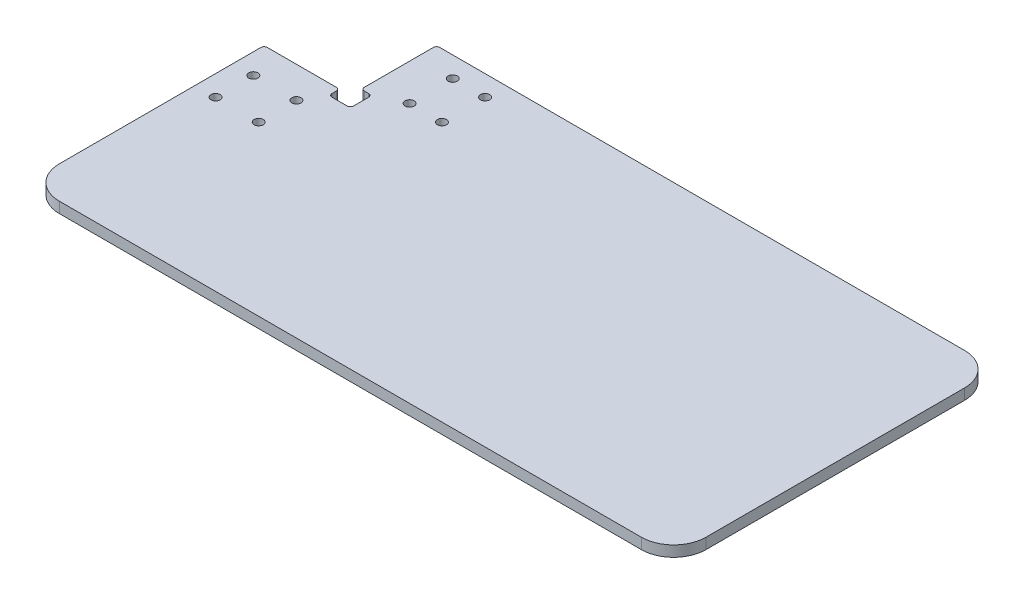
ISO-10303-21;
HEADER;
FILE_DESCRIPTION(('STEP AP214'),'2;1');
FILE_NAME('part.step','',(''),(''),'','','');
FILE_SCHEMA(('AUTOMOTIVE_DESIGN { 1 0 10303 214 1 1 1 1 }'));
ENDSEC;
DATA;
#1=APPLICATION_CONTEXT('core data for automotive mechanical design processes');
#2=APPLICATION_PROTOCOL_DEFINITION('international standard','automotive_design',2000,#1);
#3=PRODUCT_CONTEXT('',#1,'mechanical');
#4=PRODUCT('Part','Part','',(#3));
#5=PRODUCT_RELATED_PRODUCT_CATEGORY('part','',(#4));
#6=PRODUCT_DEFINITION_FORMATION('','',#4);
#7=PRODUCT_DEFINITION_CONTEXT('part definition',#1,'design');
#8=PRODUCT_DEFINITION('design','',#6,#7);
#9=PRODUCT_DEFINITION_SHAPE('','',#8);
#10=(LENGTH_UNIT() NAMED_UNIT(*) SI_UNIT(.MILLI.,.METRE.));
#11=(NAMED_UNIT(*) PLANE_ANGLE_UNIT() SI_UNIT($,.RADIAN.));
#12=(NAMED_UNIT(*) SI_UNIT($,.STERADIAN.) SOLID_ANGLE_UNIT());
#13=UNCERTAINTY_MEASURE_WITH_UNIT(LENGTH_MEASURE(1.E-05),#10,'distance_accuracy_value','');
#14=(GEOMETRIC_REPRESENTATION_CONTEXT(3) GLOBAL_UNCERTAINTY_ASSIGNED_CONTEXT((#13)) GLOBAL_UNIT_ASSIGNED_CONTEXT((#10,
#11,#12)) REPRESENTATION_CONTEXT('',''));
#15=CARTESIAN_POINT('',(0.,0.,0.));
#16=DIRECTION('',(0.,0.,1.));
#17=DIRECTION('',(1.,0.,0.));
#18=AXIS2_PLACEMENT_3D('',#15,#16,#17);
#19=CARTESIAN_POINT('',(0.,10.,0.));
#20=DIRECTION('',(0.,1.,0.));
#21=DIRECTION('',(0.,0.,1.));
#22=AXIS2_PLACEMENT_3D('',#19,#20,#21);
#23=PLANE('',#22);
#24=CARTESIAN_POINT('',(19.,10.,144.));
#25=DIRECTION('',(0.,1.,0.));
#26=DIRECTION('',(0.,0.,1.));
#27=AXIS2_PLACEMENT_3D('',#24,#25,#26);
#28=CIRCLE('',#27,4.25);
#29=CARTESIAN_POINT('',(19.,10.,148.25));
#30=VERTEX_POINT('',#29);
#31=EDGE_CURVE('E479',#30,#30,#28,.T.);
#32=ORIENTED_EDGE('',*,*,#31,.F.);
#33=EDGE_LOOP('',(#32));
#34=FACE_BOUND('',#33,.T.);
#35=CARTESIAN_POINT('',(19.,10.,109.));
#36=DIRECTION('',(0.,1.,0.));
#37=DIRECTION('',(0.,0.,1.));
#38=AXIS2_PLACEMENT_3D('',#35,#36,#37);
#39=CIRCLE('',#38,4.25);
#40=CARTESIAN_POINT('',(19.,10.,113.25));
#41=VERTEX_POINT('',#40);
#42=EDGE_CURVE('E467',#41,#41,#39,.T.);
#43=ORIENTED_EDGE('',*,*,#42,.F.);
#44=EDGE_LOOP('',(#43));
#45=FACE_BOUND('',#44,.T.);
#46=CARTESIAN_POINT('',(144.,10.,59.));
#47=DIRECTION('',(0.,1.,0.));
#48=DIRECTION('',(0.,0.,1.));
#49=AXIS2_PLACEMENT_3D('',#46,#47,#48);
#50=CIRCLE('',#49,4.25000000000001);
#51=CARTESIAN_POINT('',(144.,10.,63.25));
#52=VERTEX_POINT('',#51);
#53=EDGE_CURVE('E455',#52,#52,#50,.T.);
#54=ORIENTED_EDGE('',*,*,#53,.F.);
#55=EDGE_LOOP('',(#54));
#56=FACE_BOUND('',#55,.T.);
#57=CARTESIAN_POINT('',(144.,10.,19.));
#58=DIRECTION('',(0.,1.,0.));
#59=DIRECTION('',(0.,0.,1.));
#60=AXIS2_PLACEMENT_3D('',#57,#58,#59);
#61=CIRCLE('',#60,4.25);
#62=CARTESIAN_POINT('',(144.,10.,23.25));
#63=VERTEX_POINT('',#62);
#64=EDGE_CURVE('E208',#63,#63,#61,.T.);
#65=ORIENTED_EDGE('',*,*,#64,.F.);
#66=EDGE_LOOP('',(#65));
#67=FACE_BOUND('',#66,.T.);
#68=DIRECTION('',(0.,0.,-1.));
#69=VECTOR('',#68,1.);
#70=CARTESIAN_POINT('',(70.,10.,90.));
#71=LINE('',#70,#69);
#72=CARTESIAN_POINT('',(70.,10.,87.));
#73=VERTEX_POINT('',#72);
#74=CARTESIAN_POINT('',(70.,10.,83.));
#75=VERTEX_POINT('',#74);
#76=EDGE_CURVE('E322',#73,#75,#71,.T.);
#77=ORIENTED_EDGE('',*,*,#76,.T.);
#78=CARTESIAN_POINT('',(67.,10.,83.));
#79=DIRECTION('',(0.,1.,0.));
#80=DIRECTION('',(0.,0.,1.));
#81=AXIS2_PLACEMENT_3D('',#78,#79,#80);
#82=CIRCLE('',#81,3.);
#83=CARTESIAN_POINT('',(67.,10.,80.));
#84=VERTEX_POINT('',#83);
#85=EDGE_CURVE('E289',#75,#84,#82,.T.);
#86=ORIENTED_EDGE('',*,*,#85,.T.);
#87=DIRECTION('',(-1.,0.,0.));
#88=VECTOR('',#87,1.);
#89=CARTESIAN_POINT('',(70.,10.,80.));
#90=LINE('',#89,#88);
#91=CARTESIAN_POINT('',(3.00000000000003,10.,80.));
#92=VERTEX_POINT('',#91);
#93=EDGE_CURVE('E328',#84,#92,#90,.T.);
#94=ORIENTED_EDGE('',*,*,#93,.T.);
#95=CARTESIAN_POINT('',(3.00000000000004,10.,83.));
#96=DIRECTION('',(0.,1.,0.));
#97=DIRECTION('',(0.,0.,1.));
#98=AXIS2_PLACEMENT_3D('',#95,#96,#97);
#99=CIRCLE('',#98,3.);
#100=CARTESIAN_POINT('',(0.,10.,83.));
#101=VERTEX_POINT('',#100);
#102=EDGE_CURVE('E50',#92,#101,#99,.T.);
#103=ORIENTED_EDGE('',*,*,#102,.T.);
#104=DIRECTION('',(0.,0.,1.));
#105=VECTOR('',#104,1.);
#106=CARTESIAN_POINT('',(0.,10.,80.));
#107=LINE('',#106,#105);
#108=CARTESIAN_POINT('',(0.,10.,270.));
#109=VERTEX_POINT('',#108);
#110=EDGE_CURVE('E330',#101,#109,#107,.T.);
#111=ORIENTED_EDGE('',*,*,#110,.T.);
#112=CARTESIAN_POINT('',(30.0000000000001,10.,270.));
#113=DIRECTION('',(0.,1.,0.));
#114=DIRECTION('',(0.,0.,1.));
#115=AXIS2_PLACEMENT_3D('',#112,#113,#114);
#116=CIRCLE('',#115,30.);
#117=CARTESIAN_POINT('',(30.0000000000001,10.,300.));
#118=VERTEX_POINT('',#117);
#119=EDGE_CURVE('E240',#109,#118,#116,.T.);
#120=ORIENTED_EDGE('',*,*,#119,.T.);
#121=DIRECTION('',(1.,0.,0.));
#122=VECTOR('',#121,1.);
#123=CARTESIAN_POINT('',(1.02132162786543E-13,10.,300.));
#124=LINE('',#123,#122);
#125=CARTESIAN_POINT('',(570.,10.,300.));
#126=VERTEX_POINT('',#125);
#127=EDGE_CURVE('E196',#118,#126,#124,.T.);
#128=ORIENTED_EDGE('',*,*,#127,.T.);
#129=CARTESIAN_POINT('',(570.,10.,270.));
#130=DIRECTION('',(0.,1.,0.));
#131=DIRECTION('',(0.,0.,1.));
#132=AXIS2_PLACEMENT_3D('',#129,#130,#131);
#133=CIRCLE('',#132,30.);
#134=CARTESIAN_POINT('',(600.,10.,270.));
#135=VERTEX_POINT('',#134);
#136=EDGE_CURVE('E238',#126,#135,#133,.T.);
#137=ORIENTED_EDGE('',*,*,#136,.T.);
#138=DIRECTION('',(0.,0.,-1.));
#139=VECTOR('',#138,1.);
#140=CARTESIAN_POINT('',(600.,10.,0.));
#141=LINE('',#140,#139);
#142=CARTESIAN_POINT('',(600.,10.,30.));
#143=VERTEX_POINT('',#142);
#144=EDGE_CURVE('E230',#135,#143,#141,.T.);
#145=ORIENTED_EDGE('',*,*,#144,.T.);
#146=CARTESIAN_POINT('',(570.,10.,30.));
#147=DIRECTION('',(0.,1.,0.));
#148=DIRECTION('',(0.,0.,1.));
#149=AXIS2_PLACEMENT_3D('',#146,#147,#148);
#150=CIRCLE('',#149,30.);
#151=CARTESIAN_POINT('',(570.,10.,0.));
#152=VERTEX_POINT('',#151);
#153=EDGE_CURVE('E242',#143,#152,#150,.T.);
#154=ORIENTED_EDGE('',*,*,#153,.T.);
#155=DIRECTION('',(-1.,0.,0.));
#156=VECTOR('',#155,1.);
#157=CARTESIAN_POINT('',(80.,10.,0.));
#158=LINE('',#157,#156);
#159=CARTESIAN_POINT('',(83.,10.,0.));
#160=VERTEX_POINT('',#159);
#161=EDGE_CURVE('E194',#152,#160,#158,.T.);
#162=ORIENTED_EDGE('',*,*,#161,.T.);
#163=CARTESIAN_POINT('',(83.,10.,3.));
#164=DIRECTION('',(0.,1.,0.));
#165=DIRECTION('',(0.,0.,1.));
#166=AXIS2_PLACEMENT_3D('',#163,#164,#165);
#167=CIRCLE('',#166,3.);
#168=CARTESIAN_POINT('',(80.,10.,3.));
#169=VERTEX_POINT('',#168);
#170=EDGE_CURVE('E285',#160,#169,#167,.T.);
#171=ORIENTED_EDGE('',*,*,#170,.T.);
#172=DIRECTION('',(0.,0.,1.));
#173=VECTOR('',#172,1.);
#174=CARTESIAN_POINT('',(80.,10.,0.));
#175=LINE('',#174,#173);
#176=CARTESIAN_POINT('',(80.,10.,67.));
#177=VERTEX_POINT('',#176);
#178=EDGE_CURVE('E440',#169,#177,#175,.T.);
#179=ORIENTED_EDGE('',*,*,#178,.T.);
#180=CARTESIAN_POINT('',(83.,10.,67.));
#181=DIRECTION('',(0.,1.,0.));
#182=DIRECTION('',(0.,0.,1.));
#183=AXIS2_PLACEMENT_3D('',#180,#181,#182);
#184=CIRCLE('',#183,3.);
#185=CARTESIAN_POINT('',(83.,10.,70.));
#186=VERTEX_POINT('',#185);
#187=EDGE_CURVE('E287',#177,#186,#184,.T.);
#188=ORIENTED_EDGE('',*,*,#187,.T.);
#189=DIRECTION('',(1.,0.,0.));
#190=VECTOR('',#189,1.);
#191=CARTESIAN_POINT('',(80.,10.,70.));
#192=LINE('',#191,#190);
#193=CARTESIAN_POINT('',(87.,10.,70.));
#194=VERTEX_POINT('',#193);
#195=EDGE_CURVE('E439',#186,#194,#192,.T.);
#196=ORIENTED_EDGE('',*,*,#195,.T.);
#197=CARTESIAN_POINT('',(87.,10.,73.));
#198=DIRECTION('',(0.,1.,0.));
#199=DIRECTION('',(0.,0.,1.));
#200=AXIS2_PLACEMENT_3D('',#197,#198,#199);
#201=CIRCLE('',#200,3.);
#202=CARTESIAN_POINT('',(90.,10.,73.));
#203=VERTEX_POINT('',#202);
#204=EDGE_CURVE('E302',#194,#203,#201,.F.);
#205=ORIENTED_EDGE('',*,*,#204,.T.);
#206=DIRECTION('',(0.,0.,1.));
#207=VECTOR('',#206,1.);
#208=CARTESIAN_POINT('',(90.,10.,70.));
#209=LINE('',#208,#207);
#210=CARTESIAN_POINT('',(90.,10.,87.));
#211=VERTEX_POINT('',#210);
#212=EDGE_CURVE('E332',#203,#211,#209,.T.);
#213=ORIENTED_EDGE('',*,*,#212,.T.);
#214=CARTESIAN_POINT('',(87.,10.,87.));
#215=DIRECTION('',(0.,1.,0.));
#216=DIRECTION('',(0.,0.,1.));
#217=AXIS2_PLACEMENT_3D('',#214,#215,#216);
#218=CIRCLE('',#217,3.);
#219=CARTESIAN_POINT('',(87.,10.,90.));
#220=VERTEX_POINT('',#219);
#221=EDGE_CURVE('E306',#211,#220,#218,.F.);
#222=ORIENTED_EDGE('',*,*,#221,.T.);
#223=DIRECTION('',(-1.,0.,0.));
#224=VECTOR('',#223,1.);
#225=CARTESIAN_POINT('',(90.,10.,90.));
#226=LINE('',#225,#224);
#227=CARTESIAN_POINT('',(73.,10.,90.));
#228=VERTEX_POINT('',#227);
#229=EDGE_CURVE('E324',#220,#228,#226,.T.);
#230=ORIENTED_EDGE('',*,*,#229,.T.);
#231=CARTESIAN_POINT('',(73.,10.,87.));
#232=DIRECTION('',(0.,1.,0.));
#233=DIRECTION('',(0.,0.,1.));
#234=AXIS2_PLACEMENT_3D('',#231,#232,#233);
#235=CIRCLE('',#234,3.);
#236=EDGE_CURVE('E11',#228,#73,#235,.F.);
#237=ORIENTED_EDGE('',*,*,#236,.T.);
#238=EDGE_LOOP('',(#77,#86,#94,#103,#111,#120,#128,#137,#145,#154,#162,#171,#179,#188,#196,#205,
#213,#222,#230,#237));
#239=FACE_BOUND('',#238,.T.);
#240=CARTESIAN_POINT('',(114.,10.,19.));
#241=DIRECTION('',(0.,1.,0.));
#242=DIRECTION('',(0.,0.,1.));
#243=AXIS2_PLACEMENT_3D('',#240,#241,#242);
#244=CIRCLE('',#243,4.25);
#245=CARTESIAN_POINT('',(114.,10.,23.25));
#246=VERTEX_POINT('',#245);
#247=EDGE_CURVE('E449',#246,#246,#244,.T.);
#248=ORIENTED_EDGE('',*,*,#247,.F.);
#249=EDGE_LOOP('',(#248));
#250=FACE_BOUND('',#249,.T.);
#251=CARTESIAN_POINT('',(114.,10.,59.));
#252=DIRECTION('',(0.,1.,0.));
#253=DIRECTION('',(0.,0.,1.));
#254=AXIS2_PLACEMENT_3D('',#251,#252,#253);
#255=CIRCLE('',#254,4.25000000000001);
#256=CARTESIAN_POINT('',(114.,10.,63.25));
#257=VERTEX_POINT('',#256);
#258=EDGE_CURVE('E461',#257,#257,#255,.T.);
#259=ORIENTED_EDGE('',*,*,#258,.F.);
#260=EDGE_LOOP('',(#259));
#261=FACE_BOUND('',#260,.T.);
#262=CARTESIAN_POINT('',(59.,10.,109.));
#263=DIRECTION('',(0.,1.,0.));
#264=DIRECTION('',(0.,0.,1.));
#265=AXIS2_PLACEMENT_3D('',#262,#263,#264);
#266=CIRCLE('',#265,4.25000000000003);
#267=CARTESIAN_POINT('',(59.,10.,113.25));
#268=VERTEX_POINT('',#267);
#269=EDGE_CURVE('E473',#268,#268,#266,.T.);
#270=ORIENTED_EDGE('',*,*,#269,.F.);
#271=EDGE_LOOP('',(#270));
#272=FACE_BOUND('',#271,.T.);
#273=CARTESIAN_POINT('',(59.,10.,144.));
#274=DIRECTION('',(0.,1.,0.));
#275=DIRECTION('',(0.,0.,1.));
#276=AXIS2_PLACEMENT_3D('',#273,#274,#275);
#277=CIRCLE('',#276,4.25000000000002);
#278=CARTESIAN_POINT('',(59.,10.,148.25));
#279=VERTEX_POINT('',#278);
#280=EDGE_CURVE('E485',#279,#279,#277,.T.);
#281=ORIENTED_EDGE('',*,*,#280,.F.);
#282=EDGE_LOOP('',(#281));
#283=FACE_BOUND('',#282,.T.);
#284=ADVANCED_FACE('F35',(#34,#45,#56,#67,#239,#250,#261,#272,#283),#23,.T.);
#285=CARTESIAN_POINT('',(0.,0.,0.));
#286=DIRECTION('',(0.,1.,0.));
#287=DIRECTION('',(0.,0.,1.));
#288=AXIS2_PLACEMENT_3D('',#285,#286,#287);
#289=PLANE('',#288);
#290=DIRECTION('',(-1.,0.,0.));
#291=VECTOR('',#290,1.);
#292=CARTESIAN_POINT('',(70.,0.,80.));
#293=LINE('',#292,#291);
#294=CARTESIAN_POINT('',(67.,0.,80.));
#295=VERTEX_POINT('',#294);
#296=CARTESIAN_POINT('',(3.00000000000003,0.,80.));
#297=VERTEX_POINT('',#296);
#298=EDGE_CURVE('E223',#295,#297,#293,.T.);
#299=ORIENTED_EDGE('',*,*,#298,.F.);
#300=CARTESIAN_POINT('',(67.,0.,83.));
#301=DIRECTION('',(0.,1.,0.));
#302=DIRECTION('',(0.,0.,1.));
#303=AXIS2_PLACEMENT_3D('',#300,#301,#302);
#304=CIRCLE('',#303,3.);
#305=CARTESIAN_POINT('',(70.,0.,83.));
#306=VERTEX_POINT('',#305);
#307=EDGE_CURVE('E282',#295,#306,#304,.F.);
#308=ORIENTED_EDGE('',*,*,#307,.T.);
#309=DIRECTION('',(0.,0.,-1.));
#310=VECTOR('',#309,1.);
#311=CARTESIAN_POINT('',(70.,0.,90.));
#312=LINE('',#311,#310);
#313=CARTESIAN_POINT('',(70.,0.,87.));
#314=VERTEX_POINT('',#313);
#315=EDGE_CURVE('E220',#314,#306,#312,.T.);
#316=ORIENTED_EDGE('',*,*,#315,.F.);
#317=CARTESIAN_POINT('',(73.,0.,87.));
#318=DIRECTION('',(0.,1.,0.));
#319=DIRECTION('',(0.,0.,1.));
#320=AXIS2_PLACEMENT_3D('',#317,#318,#319);
#321=CIRCLE('',#320,3.);
#322=CARTESIAN_POINT('',(73.,0.,90.));
#323=VERTEX_POINT('',#322);
#324=EDGE_CURVE('E43',#314,#323,#321,.T.);
#325=ORIENTED_EDGE('',*,*,#324,.T.);
#326=DIRECTION('',(-1.,0.,0.));
#327=VECTOR('',#326,1.);
#328=CARTESIAN_POINT('',(90.,0.,90.));
#329=LINE('',#328,#327);
#330=CARTESIAN_POINT('',(87.,0.,90.));
#331=VERTEX_POINT('',#330);
#332=EDGE_CURVE('E217',#331,#323,#329,.T.);
#333=ORIENTED_EDGE('',*,*,#332,.F.);
#334=CARTESIAN_POINT('',(87.,0.,87.));
#335=DIRECTION('',(0.,1.,0.));
#336=DIRECTION('',(0.,0.,1.));
#337=AXIS2_PLACEMENT_3D('',#334,#335,#336);
#338=CIRCLE('',#337,3.);
#339=CARTESIAN_POINT('',(90.,0.,87.));
#340=VERTEX_POINT('',#339);
#341=EDGE_CURVE('E304',#331,#340,#338,.T.);
#342=ORIENTED_EDGE('',*,*,#341,.T.);
#343=DIRECTION('',(0.,0.,1.));
#344=VECTOR('',#343,1.);
#345=CARTESIAN_POINT('',(90.,0.,70.));
#346=LINE('',#345,#344);
#347=CARTESIAN_POINT('',(90.,0.,73.));
#348=VERTEX_POINT('',#347);
#349=EDGE_CURVE('E214',#348,#340,#346,.T.);
#350=ORIENTED_EDGE('',*,*,#349,.F.);
#351=CARTESIAN_POINT('',(87.,0.,73.));
#352=DIRECTION('',(0.,1.,0.));
#353=DIRECTION('',(0.,0.,1.));
#354=AXIS2_PLACEMENT_3D('',#351,#352,#353);
#355=CIRCLE('',#354,3.);
#356=CARTESIAN_POINT('',(87.,0.,70.));
#357=VERTEX_POINT('',#356);
#358=EDGE_CURVE('E300',#348,#357,#355,.T.);
#359=ORIENTED_EDGE('',*,*,#358,.T.);
#360=DIRECTION('',(1.,0.,0.));
#361=VECTOR('',#360,1.);
#362=CARTESIAN_POINT('',(80.,0.,70.));
#363=LINE('',#362,#361);
#364=CARTESIAN_POINT('',(83.,0.,70.));
#365=VERTEX_POINT('',#364);
#366=EDGE_CURVE('E206',#365,#357,#363,.T.);
#367=ORIENTED_EDGE('',*,*,#366,.F.);
#368=CARTESIAN_POINT('',(83.,0.,67.));
#369=DIRECTION('',(0.,1.,0.));
#370=DIRECTION('',(0.,0.,1.));
#371=AXIS2_PLACEMENT_3D('',#368,#369,#370);
#372=CIRCLE('',#371,3.);
#373=CARTESIAN_POINT('',(80.,0.,67.));
#374=VERTEX_POINT('',#373);
#375=EDGE_CURVE('E280',#365,#374,#372,.F.);
#376=ORIENTED_EDGE('',*,*,#375,.T.);
#377=DIRECTION('',(0.,0.,1.));
#378=VECTOR('',#377,1.);
#379=CARTESIAN_POINT('',(80.,0.,0.));
#380=LINE('',#379,#378);
#381=CARTESIAN_POINT('',(80.,0.,3.));
#382=VERTEX_POINT('',#381);
#383=EDGE_CURVE('E203',#382,#374,#380,.T.);
#384=ORIENTED_EDGE('',*,*,#383,.F.);
#385=CARTESIAN_POINT('',(83.,0.,3.));
#386=DIRECTION('',(0.,1.,0.));
#387=DIRECTION('',(0.,0.,1.));
#388=AXIS2_PLACEMENT_3D('',#385,#386,#387);
#389=CIRCLE('',#388,3.);
#390=CARTESIAN_POINT('',(83.,0.,0.));
#391=VERTEX_POINT('',#390);
#392=EDGE_CURVE('E202',#382,#391,#389,.F.);
#393=ORIENTED_EDGE('',*,*,#392,.T.);
#394=DIRECTION('',(-1.,0.,0.));
#395=VECTOR('',#394,1.);
#396=CARTESIAN_POINT('',(80.,0.,0.));
#397=LINE('',#396,#395);
#398=CARTESIAN_POINT('',(570.,0.,0.));
#399=VERTEX_POINT('',#398);
#400=EDGE_CURVE('E191',#399,#391,#397,.T.);
#401=ORIENTED_EDGE('',*,*,#400,.F.);
#402=CARTESIAN_POINT('',(570.,0.,30.));
#403=DIRECTION('',(0.,1.,0.));
#404=DIRECTION('',(0.,0.,1.));
#405=AXIS2_PLACEMENT_3D('',#402,#403,#404);
#406=CIRCLE('',#405,30.);
#407=CARTESIAN_POINT('',(600.,0.,30.));
#408=VERTEX_POINT('',#407);
#409=EDGE_CURVE('E174',#399,#408,#406,.F.);
#410=ORIENTED_EDGE('',*,*,#409,.T.);
#411=DIRECTION('',(0.,0.,-1.));
#412=VECTOR('',#411,1.);
#413=CARTESIAN_POINT('',(600.,0.,0.));
#414=LINE('',#413,#412);
#415=CARTESIAN_POINT('',(600.,0.,270.));
#416=VERTEX_POINT('',#415);
#417=EDGE_CURVE('E204',#416,#408,#414,.T.);
#418=ORIENTED_EDGE('',*,*,#417,.F.);
#419=CARTESIAN_POINT('',(570.,0.,270.));
#420=DIRECTION('',(0.,1.,0.));
#421=DIRECTION('',(0.,0.,1.));
#422=AXIS2_PLACEMENT_3D('',#419,#420,#421);
#423=CIRCLE('',#422,30.);
#424=CARTESIAN_POINT('',(570.,0.,300.));
#425=VERTEX_POINT('',#424);
#426=EDGE_CURVE('E195',#416,#425,#423,.F.);
#427=ORIENTED_EDGE('',*,*,#426,.T.);
#428=DIRECTION('',(1.,0.,0.));
#429=VECTOR('',#428,1.);
#430=CARTESIAN_POINT('',(1.02132162786543E-13,0.,300.));
#431=LINE('',#430,#429);
#432=CARTESIAN_POINT('',(30.0000000000001,0.,300.));
#433=VERTEX_POINT('',#432);
#434=EDGE_CURVE('E228',#433,#425,#431,.T.);
#435=ORIENTED_EDGE('',*,*,#434,.F.);
#436=CARTESIAN_POINT('',(30.0000000000001,0.,270.));
#437=DIRECTION('',(0.,1.,0.));
#438=DIRECTION('',(0.,0.,1.));
#439=AXIS2_PLACEMENT_3D('',#436,#437,#438);
#440=CIRCLE('',#439,30.);
#441=CARTESIAN_POINT('',(0.,0.,270.));
#442=VERTEX_POINT('',#441);
#443=EDGE_CURVE('E185',#433,#442,#440,.F.);
#444=ORIENTED_EDGE('',*,*,#443,.T.);
#445=DIRECTION('',(0.,0.,1.));
#446=VECTOR('',#445,1.);
#447=CARTESIAN_POINT('',(0.,0.,80.));
#448=LINE('',#447,#446);
#449=CARTESIAN_POINT('',(0.,0.,83.));
#450=VERTEX_POINT('',#449);
#451=EDGE_CURVE('E226',#450,#442,#448,.T.);
#452=ORIENTED_EDGE('',*,*,#451,.F.);
#453=CARTESIAN_POINT('',(3.00000000000004,0.,83.));
#454=DIRECTION('',(0.,1.,0.));
#455=DIRECTION('',(0.,0.,1.));
#456=AXIS2_PLACEMENT_3D('',#453,#454,#455);
#457=CIRCLE('',#456,3.);
#458=EDGE_CURVE('E277',#450,#297,#457,.F.);
#459=ORIENTED_EDGE('',*,*,#458,.T.);
#460=EDGE_LOOP('',(#299,#308,#316,#325,#333,#342,#350,#359,#367,#376,#384,#393,#401,#410,#418,
#427,#435,#444,#452,#459));
#461=FACE_BOUND('',#460,.T.);
#462=CARTESIAN_POINT('',(144.,0.,19.));
#463=DIRECTION('',(0.,1.,0.));
#464=DIRECTION('',(0.,0.,1.));
#465=AXIS2_PLACEMENT_3D('',#462,#463,#464);
#466=CIRCLE('',#465,4.25);
#467=CARTESIAN_POINT('',(144.,0.,23.25));
#468=VERTEX_POINT('',#467);
#469=EDGE_CURVE('E446',#468,#468,#466,.T.);
#470=ORIENTED_EDGE('',*,*,#469,.T.);
#471=EDGE_LOOP('',(#470));
#472=FACE_BOUND('',#471,.T.);
#473=CARTESIAN_POINT('',(114.,0.,19.));
#474=DIRECTION('',(0.,1.,0.));
#475=DIRECTION('',(0.,0.,1.));
#476=AXIS2_PLACEMENT_3D('',#473,#474,#475);
#477=CIRCLE('',#476,4.25);
#478=CARTESIAN_POINT('',(114.,0.,23.25));
#479=VERTEX_POINT('',#478);
#480=EDGE_CURVE('E452',#479,#479,#477,.T.);
#481=ORIENTED_EDGE('',*,*,#480,.T.);
#482=EDGE_LOOP('',(#481));
#483=FACE_BOUND('',#482,.T.);
#484=CARTESIAN_POINT('',(144.,0.,59.));
#485=DIRECTION('',(0.,1.,0.));
#486=DIRECTION('',(0.,0.,1.));
#487=AXIS2_PLACEMENT_3D('',#484,#485,#486);
#488=CIRCLE('',#487,4.25000000000001);
#489=CARTESIAN_POINT('',(144.,0.,63.25));
#490=VERTEX_POINT('',#489);
#491=EDGE_CURVE('E458',#490,#490,#488,.T.);
#492=ORIENTED_EDGE('',*,*,#491,.T.);
#493=EDGE_LOOP('',(#492));
#494=FACE_BOUND('',#493,.T.);
#495=CARTESIAN_POINT('',(114.,0.,59.));
#496=DIRECTION('',(0.,1.,0.));
#497=DIRECTION('',(0.,0.,1.));
#498=AXIS2_PLACEMENT_3D('',#495,#496,#497);
#499=CIRCLE('',#498,4.25000000000001);
#500=CARTESIAN_POINT('',(114.,0.,63.25));
#501=VERTEX_POINT('',#500);
#502=EDGE_CURVE('E464',#501,#501,#499,.T.);
#503=ORIENTED_EDGE('',*,*,#502,.T.);
#504=EDGE_LOOP('',(#503));
#505=FACE_BOUND('',#504,.T.);
#506=CARTESIAN_POINT('',(19.,0.,109.));
#507=DIRECTION('',(0.,1.,0.));
#508=DIRECTION('',(0.,0.,1.));
#509=AXIS2_PLACEMENT_3D('',#506,#507,#508);
#510=CIRCLE('',#509,4.25);
#511=CARTESIAN_POINT('',(19.,0.,113.25));
#512=VERTEX_POINT('',#511);
#513=EDGE_CURVE('E470',#512,#512,#510,.T.);
#514=ORIENTED_EDGE('',*,*,#513,.T.);
#515=EDGE_LOOP('',(#514));
#516=FACE_BOUND('',#515,.T.);
#517=CARTESIAN_POINT('',(59.,0.,109.));
#518=DIRECTION('',(0.,1.,0.));
#519=DIRECTION('',(0.,0.,1.));
#520=AXIS2_PLACEMENT_3D('',#517,#518,#519);
#521=CIRCLE('',#520,4.25000000000003);
#522=CARTESIAN_POINT('',(59.,0.,113.25));
#523=VERTEX_POINT('',#522);
#524=EDGE_CURVE('E476',#523,#523,#521,.T.);
#525=ORIENTED_EDGE('',*,*,#524,.T.);
#526=EDGE_LOOP('',(#525));
#527=FACE_BOUND('',#526,.T.);
#528=CARTESIAN_POINT('',(19.,0.,144.));
#529=DIRECTION('',(0.,1.,0.));
#530=DIRECTION('',(0.,0.,1.));
#531=AXIS2_PLACEMENT_3D('',#528,#529,#530);
#532=CIRCLE('',#531,4.25);
#533=CARTESIAN_POINT('',(19.,0.,148.25));
#534=VERTEX_POINT('',#533);
#535=EDGE_CURVE('E482',#534,#534,#532,.T.);
#536=ORIENTED_EDGE('',*,*,#535,.T.);
#537=EDGE_LOOP('',(#536));
#538=FACE_BOUND('',#537,.T.);
#539=CARTESIAN_POINT('',(59.,0.,144.));
#540=DIRECTION('',(0.,1.,0.));
#541=DIRECTION('',(0.,0.,1.));
#542=AXIS2_PLACEMENT_3D('',#539,#540,#541);
#543=CIRCLE('',#542,4.25000000000002);
#544=CARTESIAN_POINT('',(59.,0.,148.25));
#545=VERTEX_POINT('',#544);
#546=EDGE_CURVE('E488',#545,#545,#543,.T.);
#547=ORIENTED_EDGE('',*,*,#546,.T.);
#548=EDGE_LOOP('',(#547));
#549=FACE_BOUND('',#548,.T.);
#550=ADVANCED_FACE('F199',(#461,#472,#483,#494,#505,#516,#527,#538,#549),#289,.F.);
#551=CARTESIAN_POINT('',(600.,10.,0.));
#552=DIRECTION('',(-1.,0.,0.));
#553=DIRECTION('',(0.,0.,1.));
#554=AXIS2_PLACEMENT_3D('',#551,#552,#553);
#555=PLANE('',#554);
#556=ORIENTED_EDGE('',*,*,#417,.T.);
#557=DIRECTION('',(0.,-1.,0.));
#558=VECTOR('',#557,1.);
#559=CARTESIAN_POINT('',(600.,10.,30.));
#560=LINE('',#559,#558);
#561=EDGE_CURVE('E179',#408,#143,#560,.F.);
#562=ORIENTED_EDGE('',*,*,#561,.T.);
#563=ORIENTED_EDGE('',*,*,#144,.F.);
#564=DIRECTION('',(0.,-1.,0.));
#565=VECTOR('',#564,1.);
#566=CARTESIAN_POINT('',(600.,10.,270.));
#567=LINE('',#566,#565);
#568=EDGE_CURVE('E184',#135,#416,#567,.T.);
#569=ORIENTED_EDGE('',*,*,#568,.T.);
#570=EDGE_LOOP('',(#556,#562,#563,#569));
#571=FACE_BOUND('',#570,.T.);
#572=ADVANCED_FACE('F349',(#571),#555,.F.);
#573=CARTESIAN_POINT('',(80.,10.,0.));
#574=DIRECTION('',(0.,0.,1.));
#575=DIRECTION('',(1.,0.,0.));
#576=AXIS2_PLACEMENT_3D('',#573,#574,#575);
#577=PLANE('',#576);
#578=ORIENTED_EDGE('',*,*,#400,.T.);
#579=DIRECTION('',(0.,-1.,0.));
#580=VECTOR('',#579,1.);
#581=CARTESIAN_POINT('',(83.,10.,0.));
#582=LINE('',#581,#580);
#583=EDGE_CURVE('E295',#391,#160,#582,.F.);
#584=ORIENTED_EDGE('',*,*,#583,.T.);
#585=ORIENTED_EDGE('',*,*,#161,.F.);
#586=DIRECTION('',(0.,-1.,0.));
#587=VECTOR('',#586,1.);
#588=CARTESIAN_POINT('',(570.,10.,0.));
#589=LINE('',#588,#587);
#590=EDGE_CURVE('E178',#152,#399,#589,.T.);
#591=ORIENTED_EDGE('',*,*,#590,.T.);
#592=EDGE_LOOP('',(#578,#584,#585,#591));
#593=FACE_BOUND('',#592,.T.);
#594=ADVANCED_FACE('F190',(#593),#577,.F.);
#595=CARTESIAN_POINT('',(80.,10.,0.));
#596=DIRECTION('',(1.,0.,0.));
#597=DIRECTION('',(0.,0.,-1.));
#598=AXIS2_PLACEMENT_3D('',#595,#596,#597);
#599=PLANE('',#598);
#600=ORIENTED_EDGE('',*,*,#383,.T.);
#601=DIRECTION('',(0.,-1.,0.));
#602=VECTOR('',#601,1.);
#603=CARTESIAN_POINT('',(80.,10.,67.));
#604=LINE('',#603,#602);
#605=EDGE_CURVE('E58',#374,#177,#604,.F.);
#606=ORIENTED_EDGE('',*,*,#605,.T.);
#607=ORIENTED_EDGE('',*,*,#178,.F.);
#608=DIRECTION('',(0.,-1.,0.));
#609=VECTOR('',#608,1.);
#610=CARTESIAN_POINT('',(80.,10.,3.));
#611=LINE('',#610,#609);
#612=EDGE_CURVE('E291',#169,#382,#611,.T.);
#613=ORIENTED_EDGE('',*,*,#612,.T.);
#614=EDGE_LOOP('',(#600,#606,#607,#613));
#615=FACE_BOUND('',#614,.T.);
#616=ADVANCED_FACE('F409',(#615),#599,.F.);
#617=CARTESIAN_POINT('',(80.,10.,70.));
#618=DIRECTION('',(0.,0.,-1.));
#619=DIRECTION('',(-1.,0.,0.));
#620=AXIS2_PLACEMENT_3D('',#617,#618,#619);
#621=PLANE('',#620);
#622=ORIENTED_EDGE('',*,*,#366,.T.);
#623=DIRECTION('',(0.,-1.,0.));
#624=VECTOR('',#623,1.);
#625=CARTESIAN_POINT('',(87.,10.,70.));
#626=LINE('',#625,#624);
#627=EDGE_CURVE('E260',#357,#194,#626,.F.);
#628=ORIENTED_EDGE('',*,*,#627,.T.);
#629=ORIENTED_EDGE('',*,*,#195,.F.);
#630=DIRECTION('',(0.,-1.,0.));
#631=VECTOR('',#630,1.);
#632=CARTESIAN_POINT('',(83.,10.,70.));
#633=LINE('',#632,#631);
#634=EDGE_CURVE('E257',#186,#365,#633,.T.);
#635=ORIENTED_EDGE('',*,*,#634,.T.);
#636=EDGE_LOOP('',(#622,#628,#629,#635));
#637=FACE_BOUND('',#636,.T.);
#638=ADVANCED_FACE('F405',(#637),#621,.F.);
#639=CARTESIAN_POINT('',(90.,10.,70.));
#640=DIRECTION('',(1.,0.,0.));
#641=DIRECTION('',(0.,0.,-1.));
#642=AXIS2_PLACEMENT_3D('',#639,#640,#641);
#643=PLANE('',#642);
#644=ORIENTED_EDGE('',*,*,#212,.F.);
#645=DIRECTION('',(0.,-1.,0.));
#646=VECTOR('',#645,1.);
#647=CARTESIAN_POINT('',(90.,0.,73.));
#648=LINE('',#647,#646);
#649=EDGE_CURVE('E254',#203,#348,#648,.T.);
#650=ORIENTED_EDGE('',*,*,#649,.T.);
#651=ORIENTED_EDGE('',*,*,#349,.T.);
#652=DIRECTION('',(0.,-1.,0.));
#653=VECTOR('',#652,1.);
#654=CARTESIAN_POINT('',(90.,10.,87.));
#655=LINE('',#654,#653);
#656=EDGE_CURVE('E252',#340,#211,#655,.F.);
#657=ORIENTED_EDGE('',*,*,#656,.T.);
#658=EDGE_LOOP('',(#644,#650,#651,#657));
#659=FACE_BOUND('',#658,.T.);
#660=ADVANCED_FACE('F402',(#659),#643,.F.);
#661=CARTESIAN_POINT('',(90.,10.,90.));
#662=DIRECTION('',(0.,0.,1.));
#663=DIRECTION('',(1.,0.,0.));
#664=AXIS2_PLACEMENT_3D('',#661,#662,#663);
#665=PLANE('',#664);
#666=ORIENTED_EDGE('',*,*,#229,.F.);
#667=DIRECTION('',(0.,-1.,0.));
#668=VECTOR('',#667,1.);
#669=CARTESIAN_POINT('',(87.,0.,90.));
#670=LINE('',#669,#668);
#671=EDGE_CURVE('E264',#220,#331,#670,.T.);
#672=ORIENTED_EDGE('',*,*,#671,.T.);
#673=ORIENTED_EDGE('',*,*,#332,.T.);
#674=DIRECTION('',(0.,-1.,0.));
#675=VECTOR('',#674,1.);
#676=CARTESIAN_POINT('',(73.,10.,90.));
#677=LINE('',#676,#675);
#678=EDGE_CURVE('E262',#323,#228,#677,.F.);
#679=ORIENTED_EDGE('',*,*,#678,.T.);
#680=EDGE_LOOP('',(#666,#672,#673,#679));
#681=FACE_BOUND('',#680,.T.);
#682=ADVANCED_FACE('F314',(#681),#665,.F.);
#683=CARTESIAN_POINT('',(70.,10.,90.));
#684=DIRECTION('',(-1.,0.,0.));
#685=DIRECTION('',(0.,0.,1.));
#686=AXIS2_PLACEMENT_3D('',#683,#684,#685);
#687=PLANE('',#686);
#688=ORIENTED_EDGE('',*,*,#76,.F.);
#689=DIRECTION('',(0.,-1.,0.));
#690=VECTOR('',#689,1.);
#691=CARTESIAN_POINT('',(70.,0.,87.));
#692=LINE('',#691,#690);
#693=EDGE_CURVE('E269',#73,#314,#692,.T.);
#694=ORIENTED_EDGE('',*,*,#693,.T.);
#695=ORIENTED_EDGE('',*,*,#315,.T.);
#696=DIRECTION('',(0.,-1.,0.));
#697=VECTOR('',#696,1.);
#698=CARTESIAN_POINT('',(70.,10.,83.));
#699=LINE('',#698,#697);
#700=EDGE_CURVE('E267',#306,#75,#699,.F.);
#701=ORIENTED_EDGE('',*,*,#700,.T.);
#702=EDGE_LOOP('',(#688,#694,#695,#701));
#703=FACE_BOUND('',#702,.T.);
#704=ADVANCED_FACE('F326',(#703),#687,.F.);
#705=CARTESIAN_POINT('',(70.,10.,80.));
#706=DIRECTION('',(0.,0.,1.));
#707=DIRECTION('',(1.,0.,0.));
#708=AXIS2_PLACEMENT_3D('',#705,#706,#707);
#709=PLANE('',#708);
#710=ORIENTED_EDGE('',*,*,#93,.F.);
#711=DIRECTION('',(0.,-1.,0.));
#712=VECTOR('',#711,1.);
#713=CARTESIAN_POINT('',(67.,10.,80.));
#714=LINE('',#713,#712);
#715=EDGE_CURVE('E274',#84,#295,#714,.T.);
#716=ORIENTED_EDGE('',*,*,#715,.T.);
#717=ORIENTED_EDGE('',*,*,#298,.T.);
#718=DIRECTION('',(0.,-1.,0.));
#719=VECTOR('',#718,1.);
#720=CARTESIAN_POINT('',(3.00000000000003,10.,80.));
#721=LINE('',#720,#719);
#722=EDGE_CURVE('E272',#297,#92,#721,.F.);
#723=ORIENTED_EDGE('',*,*,#722,.T.);
#724=EDGE_LOOP('',(#710,#716,#717,#723));
#725=FACE_BOUND('',#724,.T.);
#726=ADVANCED_FACE('F363',(#725),#709,.F.);
#727=CARTESIAN_POINT('',(0.,10.,80.));
#728=DIRECTION('',(1.,0.,0.));
#729=DIRECTION('',(0.,0.,-1.));
#730=AXIS2_PLACEMENT_3D('',#727,#728,#729);
#731=PLANE('',#730);
#732=ORIENTED_EDGE('',*,*,#110,.F.);
#733=DIRECTION('',(0.,-1.,0.));
#734=VECTOR('',#733,1.);
#735=CARTESIAN_POINT('',(0.,10.,83.));
#736=LINE('',#735,#734);
#737=EDGE_CURVE('E297',#101,#450,#736,.T.);
#738=ORIENTED_EDGE('',*,*,#737,.T.);
#739=ORIENTED_EDGE('',*,*,#451,.T.);
#740=DIRECTION('',(0.,-1.,0.));
#741=VECTOR('',#740,1.);
#742=CARTESIAN_POINT('',(0.,10.,270.));
#743=LINE('',#742,#741);
#744=EDGE_CURVE('E249',#442,#109,#743,.F.);
#745=ORIENTED_EDGE('',*,*,#744,.T.);
#746=EDGE_LOOP('',(#732,#738,#739,#745));
#747=FACE_BOUND('',#746,.T.);
#748=ADVANCED_FACE('F357',(#747),#731,.F.);
#749=CARTESIAN_POINT('',(1.02132162786543E-13,10.,300.));
#750=DIRECTION('',(0.,0.,-1.));
#751=DIRECTION('',(-1.,0.,0.));
#752=AXIS2_PLACEMENT_3D('',#749,#750,#751);
#753=PLANE('',#752);
#754=ORIENTED_EDGE('',*,*,#127,.F.);
#755=DIRECTION('',(0.,-1.,0.));
#756=VECTOR('',#755,1.);
#757=CARTESIAN_POINT('',(30.0000000000001,10.,300.));
#758=LINE('',#757,#756);
#759=EDGE_CURVE('E246',#118,#433,#758,.T.);
#760=ORIENTED_EDGE('',*,*,#759,.T.);
#761=ORIENTED_EDGE('',*,*,#434,.T.);
#762=DIRECTION('',(0.,-1.,0.));
#763=VECTOR('',#762,1.);
#764=CARTESIAN_POINT('',(570.,10.,300.));
#765=LINE('',#764,#763);
#766=EDGE_CURVE('E244',#425,#126,#765,.F.);
#767=ORIENTED_EDGE('',*,*,#766,.T.);
#768=EDGE_LOOP('',(#754,#760,#761,#767));
#769=FACE_BOUND('',#768,.T.);
#770=ADVANCED_FACE('F351',(#769),#753,.F.);
#771=CARTESIAN_POINT('',(144.,10.,19.));
#772=DIRECTION('',(0.,-1.,0.));
#773=DIRECTION('',(0.,0.,-1.));
#774=AXIS2_PLACEMENT_3D('',#771,#772,#773);
#775=CYLINDRICAL_SURFACE('',#774,4.25);
#776=ORIENTED_EDGE('',*,*,#64,.T.);
#777=EDGE_LOOP('',(#776));
#778=FACE_BOUND('',#777,.T.);
#779=ORIENTED_EDGE('',*,*,#469,.F.);
#780=EDGE_LOOP('',(#779));
#781=FACE_BOUND('',#780,.T.);
#782=ADVANCED_FACE('F389',(#778,#781),#775,.F.);
#783=CARTESIAN_POINT('',(114.,10.,19.));
#784=DIRECTION('',(0.,-1.,0.));
#785=DIRECTION('',(0.,0.,-1.));
#786=AXIS2_PLACEMENT_3D('',#783,#784,#785);
#787=CYLINDRICAL_SURFACE('',#786,4.25);
#788=ORIENTED_EDGE('',*,*,#247,.T.);
#789=EDGE_LOOP('',(#788));
#790=FACE_BOUND('',#789,.T.);
#791=ORIENTED_EDGE('',*,*,#480,.F.);
#792=EDGE_LOOP('',(#791));
#793=FACE_BOUND('',#792,.T.);
#794=ADVANCED_FACE('F521',(#790,#793),#787,.F.);
#795=CARTESIAN_POINT('',(144.,10.,59.));
#796=DIRECTION('',(0.,-1.,0.));
#797=DIRECTION('',(0.,0.,-1.));
#798=AXIS2_PLACEMENT_3D('',#795,#796,#797);
#799=CYLINDRICAL_SURFACE('',#798,4.25000000000001);
#800=ORIENTED_EDGE('',*,*,#53,.T.);
#801=EDGE_LOOP('',(#800));
#802=FACE_BOUND('',#801,.T.);
#803=ORIENTED_EDGE('',*,*,#491,.F.);
#804=EDGE_LOOP('',(#803));
#805=FACE_BOUND('',#804,.T.);
#806=ADVANCED_FACE('F518',(#802,#805),#799,.F.);
#807=CARTESIAN_POINT('',(114.,10.,59.));
#808=DIRECTION('',(0.,-1.,0.));
#809=DIRECTION('',(0.,0.,-1.));
#810=AXIS2_PLACEMENT_3D('',#807,#808,#809);
#811=CYLINDRICAL_SURFACE('',#810,4.25000000000001);
#812=ORIENTED_EDGE('',*,*,#258,.T.);
#813=EDGE_LOOP('',(#812));
#814=FACE_BOUND('',#813,.T.);
#815=ORIENTED_EDGE('',*,*,#502,.F.);
#816=EDGE_LOOP('',(#815));
#817=FACE_BOUND('',#816,.T.);
#818=ADVANCED_FACE('F514',(#814,#817),#811,.F.);
#819=CARTESIAN_POINT('',(19.,10.,109.));
#820=DIRECTION('',(0.,-1.,0.));
#821=DIRECTION('',(0.,0.,-1.));
#822=AXIS2_PLACEMENT_3D('',#819,#820,#821);
#823=CYLINDRICAL_SURFACE('',#822,4.25);
#824=ORIENTED_EDGE('',*,*,#42,.T.);
#825=EDGE_LOOP('',(#824));
#826=FACE_BOUND('',#825,.T.);
#827=ORIENTED_EDGE('',*,*,#513,.F.);
#828=EDGE_LOOP('',(#827));
#829=FACE_BOUND('',#828,.T.);
#830=ADVANCED_FACE('F510',(#826,#829),#823,.F.);
#831=CARTESIAN_POINT('',(59.,10.,109.));
#832=DIRECTION('',(0.,-1.,0.));
#833=DIRECTION('',(0.,0.,-1.));
#834=AXIS2_PLACEMENT_3D('',#831,#832,#833);
#835=CYLINDRICAL_SURFACE('',#834,4.25000000000003);
#836=ORIENTED_EDGE('',*,*,#269,.T.);
#837=EDGE_LOOP('',(#836));
#838=FACE_BOUND('',#837,.T.);
#839=ORIENTED_EDGE('',*,*,#524,.F.);
#840=EDGE_LOOP('',(#839));
#841=FACE_BOUND('',#840,.T.);
#842=ADVANCED_FACE('F504',(#838,#841),#835,.F.);
#843=CARTESIAN_POINT('',(19.,10.,144.));
#844=DIRECTION('',(0.,-1.,0.));
#845=DIRECTION('',(0.,0.,-1.));
#846=AXIS2_PLACEMENT_3D('',#843,#844,#845);
#847=CYLINDRICAL_SURFACE('',#846,4.25);
#848=ORIENTED_EDGE('',*,*,#31,.T.);
#849=EDGE_LOOP('',(#848));
#850=FACE_BOUND('',#849,.T.);
#851=ORIENTED_EDGE('',*,*,#535,.F.);
#852=EDGE_LOOP('',(#851));
#853=FACE_BOUND('',#852,.T.);
#854=ADVANCED_FACE('F497',(#850,#853),#847,.F.);
#855=CARTESIAN_POINT('',(59.,10.,144.));
#856=DIRECTION('',(0.,-1.,0.));
#857=DIRECTION('',(0.,0.,-1.));
#858=AXIS2_PLACEMENT_3D('',#855,#856,#857);
#859=CYLINDRICAL_SURFACE('',#858,4.25000000000002);
#860=ORIENTED_EDGE('',*,*,#280,.T.);
#861=EDGE_LOOP('',(#860));
#862=FACE_BOUND('',#861,.T.);
#863=ORIENTED_EDGE('',*,*,#546,.F.);
#864=EDGE_LOOP('',(#863));
#865=FACE_BOUND('',#864,.T.);
#866=ADVANCED_FACE('F419',(#862,#865),#859,.F.);
#867=CARTESIAN_POINT('',(570.,10.,30.));
#868=DIRECTION('',(0.,-1.,0.));
#869=DIRECTION('',(0.,0.,-1.));
#870=AXIS2_PLACEMENT_3D('',#867,#868,#869);
#871=CYLINDRICAL_SURFACE('',#870,30.);
#872=ORIENTED_EDGE('',*,*,#153,.F.);
#873=ORIENTED_EDGE('',*,*,#561,.F.);
#874=ORIENTED_EDGE('',*,*,#409,.F.);
#875=ORIENTED_EDGE('',*,*,#590,.F.);
#876=EDGE_LOOP('',(#872,#873,#874,#875));
#877=FACE_BOUND('',#876,.T.);
#878=ADVANCED_FACE('F177',(#877),#871,.T.);
#879=CARTESIAN_POINT('',(30.0000000000001,10.,270.));
#880=DIRECTION('',(0.,-1.,0.));
#881=DIRECTION('',(0.,0.,-1.));
#882=AXIS2_PLACEMENT_3D('',#879,#880,#881);
#883=CYLINDRICAL_SURFACE('',#882,30.);
#884=ORIENTED_EDGE('',*,*,#119,.F.);
#885=ORIENTED_EDGE('',*,*,#744,.F.);
#886=ORIENTED_EDGE('',*,*,#443,.F.);
#887=ORIENTED_EDGE('',*,*,#759,.F.);
#888=EDGE_LOOP('',(#884,#885,#886,#887));
#889=FACE_BOUND('',#888,.T.);
#890=ADVANCED_FACE('F353',(#889),#883,.T.);
#891=CARTESIAN_POINT('',(570.,10.,270.));
#892=DIRECTION('',(0.,-1.,0.));
#893=DIRECTION('',(0.,0.,-1.));
#894=AXIS2_PLACEMENT_3D('',#891,#892,#893);
#895=CYLINDRICAL_SURFACE('',#894,30.);
#896=ORIENTED_EDGE('',*,*,#136,.F.);
#897=ORIENTED_EDGE('',*,*,#766,.F.);
#898=ORIENTED_EDGE('',*,*,#426,.F.);
#899=ORIENTED_EDGE('',*,*,#568,.F.);
#900=EDGE_LOOP('',(#896,#897,#898,#899));
#901=FACE_BOUND('',#900,.T.);
#902=ADVANCED_FACE('F347',(#901),#895,.T.);
#903=CARTESIAN_POINT('',(87.,10.,73.));
#904=DIRECTION('',(0.,1.,0.));
#905=DIRECTION('',(0.,0.,1.));
#906=AXIS2_PLACEMENT_3D('',#903,#904,#905);
#907=CYLINDRICAL_SURFACE('',#906,3.);
#908=ORIENTED_EDGE('',*,*,#204,.F.);
#909=ORIENTED_EDGE('',*,*,#627,.F.);
#910=ORIENTED_EDGE('',*,*,#358,.F.);
#911=ORIENTED_EDGE('',*,*,#649,.F.);
#912=EDGE_LOOP('',(#908,#909,#910,#911));
#913=FACE_BOUND('',#912,.T.);
#914=ADVANCED_FACE('F424',(#913),#907,.F.);
#915=CARTESIAN_POINT('',(87.,10.,87.));
#916=DIRECTION('',(0.,1.,0.));
#917=DIRECTION('',(0.,0.,1.));
#918=AXIS2_PLACEMENT_3D('',#915,#916,#917);
#919=CYLINDRICAL_SURFACE('',#918,3.);
#920=ORIENTED_EDGE('',*,*,#221,.F.);
#921=ORIENTED_EDGE('',*,*,#656,.F.);
#922=ORIENTED_EDGE('',*,*,#341,.F.);
#923=ORIENTED_EDGE('',*,*,#671,.F.);
#924=EDGE_LOOP('',(#920,#921,#922,#923));
#925=FACE_BOUND('',#924,.T.);
#926=ADVANCED_FACE('F377',(#925),#919,.F.);
#927=CARTESIAN_POINT('',(73.,10.,87.));
#928=DIRECTION('',(0.,1.,0.));
#929=DIRECTION('',(0.,0.,1.));
#930=AXIS2_PLACEMENT_3D('',#927,#928,#929);
#931=CYLINDRICAL_SURFACE('',#930,3.);
#932=ORIENTED_EDGE('',*,*,#236,.F.);
#933=ORIENTED_EDGE('',*,*,#678,.F.);
#934=ORIENTED_EDGE('',*,*,#324,.F.);
#935=ORIENTED_EDGE('',*,*,#693,.F.);
#936=EDGE_LOOP('',(#932,#933,#934,#935));
#937=FACE_BOUND('',#936,.T.);
#938=ADVANCED_FACE('F318',(#937),#931,.F.);
#939=CARTESIAN_POINT('',(67.,10.,83.));
#940=DIRECTION('',(0.,-1.,0.));
#941=DIRECTION('',(0.,0.,-1.));
#942=AXIS2_PLACEMENT_3D('',#939,#940,#941);
#943=CYLINDRICAL_SURFACE('',#942,3.);
#944=ORIENTED_EDGE('',*,*,#85,.F.);
#945=ORIENTED_EDGE('',*,*,#700,.F.);
#946=ORIENTED_EDGE('',*,*,#307,.F.);
#947=ORIENTED_EDGE('',*,*,#715,.F.);
#948=EDGE_LOOP('',(#944,#945,#946,#947));
#949=FACE_BOUND('',#948,.T.);
#950=ADVANCED_FACE('F366',(#949),#943,.T.);
#951=CARTESIAN_POINT('',(83.,10.,67.));
#952=DIRECTION('',(0.,-1.,0.));
#953=DIRECTION('',(0.,0.,-1.));
#954=AXIS2_PLACEMENT_3D('',#951,#952,#953);
#955=CYLINDRICAL_SURFACE('',#954,3.);
#956=ORIENTED_EDGE('',*,*,#187,.F.);
#957=ORIENTED_EDGE('',*,*,#605,.F.);
#958=ORIENTED_EDGE('',*,*,#375,.F.);
#959=ORIENTED_EDGE('',*,*,#634,.F.);
#960=EDGE_LOOP('',(#956,#957,#958,#959));
#961=FACE_BOUND('',#960,.T.);
#962=ADVANCED_FACE('F368',(#961),#955,.T.);
#963=CARTESIAN_POINT('',(83.,10.,3.));
#964=DIRECTION('',(0.,-1.,0.));
#965=DIRECTION('',(0.,0.,-1.));
#966=AXIS2_PLACEMENT_3D('',#963,#964,#965);
#967=CYLINDRICAL_SURFACE('',#966,3.);
#968=ORIENTED_EDGE('',*,*,#170,.F.);
#969=ORIENTED_EDGE('',*,*,#583,.F.);
#970=ORIENTED_EDGE('',*,*,#392,.F.);
#971=ORIENTED_EDGE('',*,*,#612,.F.);
#972=EDGE_LOOP('',(#968,#969,#970,#971));
#973=FACE_BOUND('',#972,.T.);
#974=ADVANCED_FACE('F374',(#973),#967,.T.);
#975=CARTESIAN_POINT('',(3.00000000000004,10.,83.));
#976=DIRECTION('',(0.,-1.,0.));
#977=DIRECTION('',(0.,0.,-1.));
#978=AXIS2_PLACEMENT_3D('',#975,#976,#977);
#979=CYLINDRICAL_SURFACE('',#978,3.);
#980=ORIENTED_EDGE('',*,*,#102,.F.);
#981=ORIENTED_EDGE('',*,*,#722,.F.);
#982=ORIENTED_EDGE('',*,*,#458,.F.);
#983=ORIENTED_EDGE('',*,*,#737,.F.);
#984=EDGE_LOOP('',(#980,#981,#982,#983));
#985=FACE_BOUND('',#984,.T.);
#986=ADVANCED_FACE('F37',(#985),#979,.T.);
#987=CLOSED_SHELL('',(#284,#550,#572,#594,#616,#638,#660,#682,#704,#726,#748,#770,#782,#794,
#806,#818,#830,#842,#854,#866,#878,#890,#902,#914,#926,#938,#950,#962,#974,#986));
#988=MANIFOLD_SOLID_BREP('B2',#987);
#989=ADVANCED_BREP_SHAPE_REPRESENTATION('',(#18,#988),#14);
#990=SHAPE_DEFINITION_REPRESENTATION(#9,#989);
ENDSEC;
END-ISO-10303-21;
